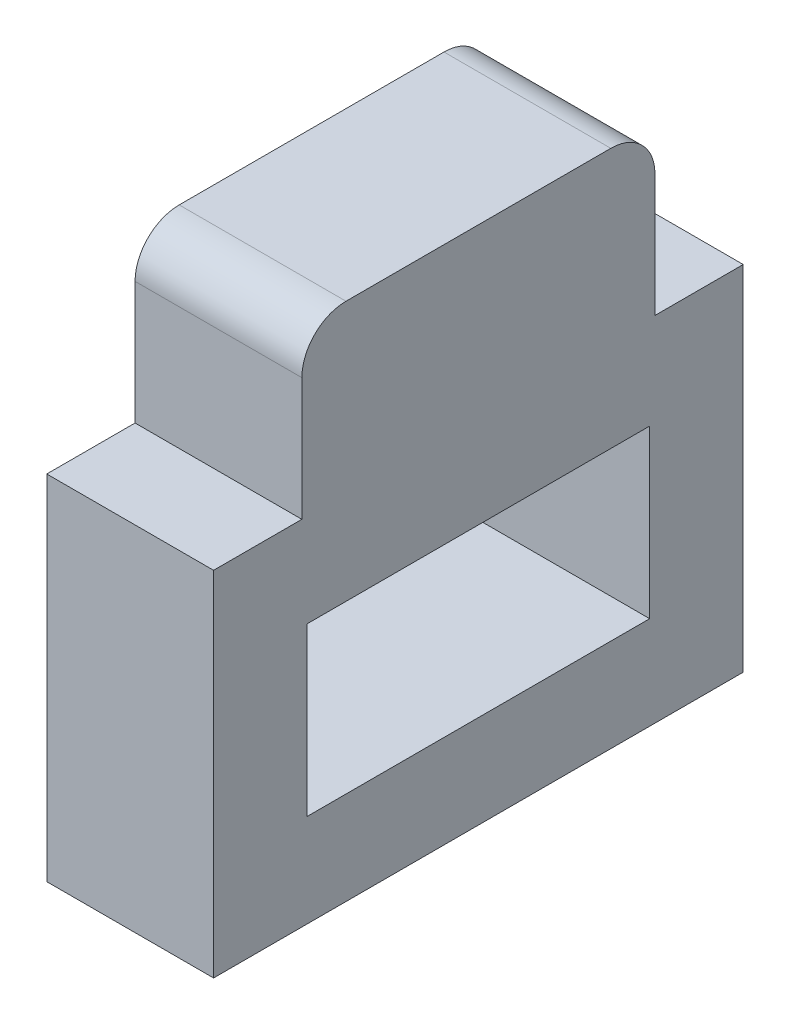
ISO-10303-21;
HEADER;
FILE_DESCRIPTION(('STEP AP214'),'2;1');
FILE_NAME('part.step','',(''),(''),'','','');
FILE_SCHEMA(('AUTOMOTIVE_DESIGN { 1 0 10303 214 1 1 1 1 }'));
ENDSEC;
DATA;
#1=APPLICATION_CONTEXT('core data for automotive mechanical design processes');
#2=APPLICATION_PROTOCOL_DEFINITION('international standard','automotive_design',2000,#1);
#3=PRODUCT_CONTEXT('',#1,'mechanical');
#4=PRODUCT('Part','Part','',(#3));
#5=PRODUCT_RELATED_PRODUCT_CATEGORY('part','',(#4));
#6=PRODUCT_DEFINITION_FORMATION('','',#4);
#7=PRODUCT_DEFINITION_CONTEXT('part definition',#1,'design');
#8=PRODUCT_DEFINITION('design','',#6,#7);
#9=PRODUCT_DEFINITION_SHAPE('','',#8);
#10=(LENGTH_UNIT() NAMED_UNIT(*) SI_UNIT(.MILLI.,.METRE.));
#11=(NAMED_UNIT(*) PLANE_ANGLE_UNIT() SI_UNIT($,.RADIAN.));
#12=(NAMED_UNIT(*) SI_UNIT($,.STERADIAN.) SOLID_ANGLE_UNIT());
#13=UNCERTAINTY_MEASURE_WITH_UNIT(LENGTH_MEASURE(1.E-05),#10,'distance_accuracy_value','');
#14=(GEOMETRIC_REPRESENTATION_CONTEXT(3) GLOBAL_UNCERTAINTY_ASSIGNED_CONTEXT((#13)) GLOBAL_UNIT_ASSIGNED_CONTEXT((#10,
#11,#12)) REPRESENTATION_CONTEXT('',''));
#15=CARTESIAN_POINT('',(0.,0.,0.));
#16=DIRECTION('',(0.,0.,1.));
#17=DIRECTION('',(1.,0.,0.));
#18=AXIS2_PLACEMENT_3D('',#15,#16,#17);
#19=CARTESIAN_POINT('',(3.,6.35,-9.525));
#20=DIRECTION('',(0.,-1.,0.));
#21=DIRECTION('',(0.,0.,-1.));
#22=AXIS2_PLACEMENT_3D('',#19,#20,#21);
#23=PLANE('',#22);
#24=DIRECTION('',(1.,0.,0.));
#25=VECTOR('',#24,1.);
#26=CARTESIAN_POINT('',(-3.,6.35,6.35));
#27=LINE('',#26,#25);
#28=CARTESIAN_POINT('',(-3.,6.35,6.34999999999999));
#29=VERTEX_POINT('',#28);
#30=CARTESIAN_POINT('',(3.,6.35,6.35));
#31=VERTEX_POINT('',#30);
#32=EDGE_CURVE('E216',#29,#31,#27,.T.);
#33=ORIENTED_EDGE('',*,*,#32,.F.);
#34=DIRECTION('',(0.,0.,1.));
#35=VECTOR('',#34,1.);
#36=CARTESIAN_POINT('',(-3.,6.35,-9.525));
#37=LINE('',#36,#35);
#38=CARTESIAN_POINT('',(-3.,6.35,9.52500000000001));
#39=VERTEX_POINT('',#38);
#40=EDGE_CURVE('E291',#29,#39,#37,.T.);
#41=ORIENTED_EDGE('',*,*,#40,.T.);
#42=DIRECTION('',(-1.,0.,0.));
#43=VECTOR('',#42,1.);
#44=CARTESIAN_POINT('',(3.,6.35,9.52500000000001));
#45=LINE('',#44,#43);
#46=CARTESIAN_POINT('',(3.,6.35,9.52500000000001));
#47=VERTEX_POINT('',#46);
#48=EDGE_CURVE('E282',#47,#39,#45,.T.);
#49=ORIENTED_EDGE('',*,*,#48,.F.);
#50=DIRECTION('',(0.,0.,1.));
#51=VECTOR('',#50,1.);
#52=CARTESIAN_POINT('',(3.,6.35,-9.525));
#53=LINE('',#52,#51);
#54=EDGE_CURVE('E305',#31,#47,#53,.T.);
#55=ORIENTED_EDGE('',*,*,#54,.F.);
#56=EDGE_LOOP('',(#33,#41,#49,#55));
#57=FACE_BOUND('',#56,.T.);
#58=ADVANCED_FACE('F48',(#57),#23,.F.);
#59=CARTESIAN_POINT('',(3.,-6.35,9.52500000000001));
#60=DIRECTION('',(0.,0.,-1.));
#61=DIRECTION('',(-1.,0.,0.));
#62=AXIS2_PLACEMENT_3D('',#59,#60,#61);
#63=PLANE('',#62);
#64=DIRECTION('',(0.,-1.,0.));
#65=VECTOR('',#64,1.);
#66=CARTESIAN_POINT('',(-3.,-6.35,9.52500000000001));
#67=LINE('',#66,#65);
#68=CARTESIAN_POINT('',(-3.,-6.35,9.52500000000001));
#69=VERTEX_POINT('',#68);
#70=EDGE_CURVE('E298',#39,#69,#67,.T.);
#71=ORIENTED_EDGE('',*,*,#70,.T.);
#72=DIRECTION('',(-1.,0.,0.));
#73=VECTOR('',#72,1.);
#74=CARTESIAN_POINT('',(3.,-6.35,9.52500000000001));
#75=LINE('',#74,#73);
#76=CARTESIAN_POINT('',(3.,-6.35,9.52500000000001));
#77=VERTEX_POINT('',#76);
#78=EDGE_CURVE('E267',#77,#69,#75,.T.);
#79=ORIENTED_EDGE('',*,*,#78,.F.);
#80=DIRECTION('',(0.,-1.,0.));
#81=VECTOR('',#80,1.);
#82=CARTESIAN_POINT('',(3.,-6.35,9.52500000000001));
#83=LINE('',#82,#81);
#84=EDGE_CURVE('E290',#47,#77,#83,.T.);
#85=ORIENTED_EDGE('',*,*,#84,.F.);
#86=ORIENTED_EDGE('',*,*,#48,.T.);
#87=EDGE_LOOP('',(#71,#79,#85,#86));
#88=FACE_BOUND('',#87,.T.);
#89=ADVANCED_FACE('F338',(#88),#63,.F.);
#90=CARTESIAN_POINT('',(3.,-6.35,-9.525));
#91=DIRECTION('',(0.,1.,0.));
#92=DIRECTION('',(0.,0.,1.));
#93=AXIS2_PLACEMENT_3D('',#90,#91,#92);
#94=PLANE('',#93);
#95=DIRECTION('',(0.,0.,-1.));
#96=VECTOR('',#95,1.);
#97=CARTESIAN_POINT('',(-3.,-6.35,-9.525));
#98=LINE('',#97,#96);
#99=CARTESIAN_POINT('',(-3.,-6.35,-9.525));
#100=VERTEX_POINT('',#99);
#101=EDGE_CURVE('E295',#69,#100,#98,.T.);
#102=ORIENTED_EDGE('',*,*,#101,.T.);
#103=DIRECTION('',(-1.,0.,0.));
#104=VECTOR('',#103,1.);
#105=CARTESIAN_POINT('',(3.,-6.35,-9.525));
#106=LINE('',#105,#104);
#107=CARTESIAN_POINT('',(3.,-6.35,-9.525));
#108=VERTEX_POINT('',#107);
#109=EDGE_CURVE('E270',#108,#100,#106,.T.);
#110=ORIENTED_EDGE('',*,*,#109,.F.);
#111=DIRECTION('',(0.,0.,-1.));
#112=VECTOR('',#111,1.);
#113=CARTESIAN_POINT('',(3.,-6.35,-9.525));
#114=LINE('',#113,#112);
#115=EDGE_CURVE('E316',#77,#108,#114,.T.);
#116=ORIENTED_EDGE('',*,*,#115,.F.);
#117=ORIENTED_EDGE('',*,*,#78,.T.);
#118=EDGE_LOOP('',(#102,#110,#116,#117));
#119=FACE_BOUND('',#118,.T.);
#120=ADVANCED_FACE('F340',(#119),#94,.F.);
#121=CARTESIAN_POINT('',(3.,-6.35,-9.525));
#122=DIRECTION('',(0.,0.,1.));
#123=DIRECTION('',(0.,-1.,0.));
#124=AXIS2_PLACEMENT_3D('',#121,#122,#123);
#125=PLANE('',#124);
#126=DIRECTION('',(0.,1.,0.));
#127=VECTOR('',#126,1.);
#128=CARTESIAN_POINT('',(-3.,-6.35,-9.525));
#129=LINE('',#128,#127);
#130=CARTESIAN_POINT('',(-3.,6.35,-9.525));
#131=VERTEX_POINT('',#130);
#132=EDGE_CURVE('E292',#100,#131,#129,.T.);
#133=ORIENTED_EDGE('',*,*,#132,.T.);
#134=DIRECTION('',(-1.,0.,0.));
#135=VECTOR('',#134,1.);
#136=CARTESIAN_POINT('',(3.,6.35,-9.525));
#137=LINE('',#136,#135);
#138=CARTESIAN_POINT('',(3.,6.35,-9.525));
#139=VERTEX_POINT('',#138);
#140=EDGE_CURVE('E276',#139,#131,#137,.T.);
#141=ORIENTED_EDGE('',*,*,#140,.F.);
#142=DIRECTION('',(0.,1.,0.));
#143=VECTOR('',#142,1.);
#144=CARTESIAN_POINT('',(3.,-6.35,-9.525));
#145=LINE('',#144,#143);
#146=EDGE_CURVE('E306',#108,#139,#145,.T.);
#147=ORIENTED_EDGE('',*,*,#146,.F.);
#148=ORIENTED_EDGE('',*,*,#109,.T.);
#149=EDGE_LOOP('',(#133,#141,#147,#148));
#150=FACE_BOUND('',#149,.T.);
#151=ADVANCED_FACE('F342',(#150),#125,.F.);
#152=CARTESIAN_POINT('',(-3.,6.35,-6.35));
#153=VERTEX_POINT('',#152);
#154=EDGE_CURVE('E287',#131,#153,#37,.T.);
#155=ORIENTED_EDGE('',*,*,#154,.T.);
#156=DIRECTION('',(1.,0.,0.));
#157=VECTOR('',#156,1.);
#158=CARTESIAN_POINT('',(-3.,6.35,-6.35));
#159=LINE('',#158,#157);
#160=CARTESIAN_POINT('',(3.,6.35,-6.35));
#161=VERTEX_POINT('',#160);
#162=EDGE_CURVE('E206',#153,#161,#159,.T.);
#163=ORIENTED_EDGE('',*,*,#162,.T.);
#164=EDGE_CURVE('E286',#139,#161,#53,.T.);
#165=ORIENTED_EDGE('',*,*,#164,.F.);
#166=ORIENTED_EDGE('',*,*,#140,.T.);
#167=EDGE_LOOP('',(#155,#163,#165,#166));
#168=FACE_BOUND('',#167,.T.);
#169=ADVANCED_FACE('F345',(#168),#23,.F.);
#170=CARTESIAN_POINT('',(3.,0.,0.));
#171=DIRECTION('',(1.,0.,0.));
#172=DIRECTION('',(0.,0.,-1.));
#173=AXIS2_PLACEMENT_3D('',#170,#171,#172);
#174=PLANE('',#173);
#175=DIRECTION('',(0.,-1.,0.));
#176=VECTOR('',#175,1.);
#177=CARTESIAN_POINT('',(3.,-2.999999969,6.1595));
#178=LINE('',#177,#176);
#179=CARTESIAN_POINT('',(3.,2.999999969,6.1595));
#180=VERTEX_POINT('',#179);
#181=CARTESIAN_POINT('',(3.,-2.999999969,6.1595));
#182=VERTEX_POINT('',#181);
#183=EDGE_CURVE('E158',#180,#182,#178,.T.);
#184=ORIENTED_EDGE('',*,*,#183,.F.);
#185=DIRECTION('',(0.,0.,1.));
#186=VECTOR('',#185,1.);
#187=CARTESIAN_POINT('',(3.,2.999999969,-6.1595));
#188=LINE('',#187,#186);
#189=CARTESIAN_POINT('',(3.,2.999999969,-6.1595));
#190=VERTEX_POINT('',#189);
#191=EDGE_CURVE('E179',#190,#180,#188,.T.);
#192=ORIENTED_EDGE('',*,*,#191,.F.);
#193=DIRECTION('',(0.,1.,0.));
#194=VECTOR('',#193,1.);
#195=CARTESIAN_POINT('',(3.,-2.999999969,-6.1595));
#196=LINE('',#195,#194);
#197=CARTESIAN_POINT('',(3.,-2.999999969,-6.1595));
#198=VERTEX_POINT('',#197);
#199=EDGE_CURVE('E183',#198,#190,#196,.T.);
#200=ORIENTED_EDGE('',*,*,#199,.F.);
#201=DIRECTION('',(0.,0.,-1.));
#202=VECTOR('',#201,1.);
#203=CARTESIAN_POINT('',(3.,-2.999999969,-6.1595));
#204=LINE('',#203,#202);
#205=EDGE_CURVE('E193',#182,#198,#204,.T.);
#206=ORIENTED_EDGE('',*,*,#205,.F.);
#207=EDGE_LOOP('',(#184,#192,#200,#206));
#208=FACE_BOUND('',#207,.T.);
#209=DIRECTION('',(0.,-1.,0.));
#210=VECTOR('',#209,1.);
#211=CARTESIAN_POINT('',(3.,12.35,-6.35));
#212=LINE('',#211,#210);
#213=CARTESIAN_POINT('',(3.,10.7625,-6.35));
#214=VERTEX_POINT('',#213);
#215=EDGE_CURVE('E263',#214,#161,#212,.T.);
#216=ORIENTED_EDGE('',*,*,#215,.F.);
#217=CARTESIAN_POINT('',(3.,10.7625,-4.7625));
#218=DIRECTION('',(1.,0.,0.));
#219=DIRECTION('',(0.,0.,-1.));
#220=AXIS2_PLACEMENT_3D('',#217,#218,#219);
#221=CIRCLE('',#220,1.5875);
#222=CARTESIAN_POINT('',(3.,12.35,-4.7625));
#223=VERTEX_POINT('',#222);
#224=EDGE_CURVE('E235',#214,#223,#221,.T.);
#225=ORIENTED_EDGE('',*,*,#224,.T.);
#226=DIRECTION('',(0.,0.,-1.));
#227=VECTOR('',#226,1.);
#228=CARTESIAN_POINT('',(3.,12.35,6.35));
#229=LINE('',#228,#227);
#230=CARTESIAN_POINT('',(3.,12.35,4.7625));
#231=VERTEX_POINT('',#230);
#232=EDGE_CURVE('E215',#231,#223,#229,.T.);
#233=ORIENTED_EDGE('',*,*,#232,.F.);
#234=CARTESIAN_POINT('',(3.,10.7625,4.7625));
#235=DIRECTION('',(1.,0.,0.));
#236=DIRECTION('',(0.,0.,-1.));
#237=AXIS2_PLACEMENT_3D('',#234,#235,#236);
#238=CIRCLE('',#237,1.5875);
#239=CARTESIAN_POINT('',(3.,10.7625,6.35));
#240=VERTEX_POINT('',#239);
#241=EDGE_CURVE('E231',#231,#240,#238,.T.);
#242=ORIENTED_EDGE('',*,*,#241,.T.);
#243=DIRECTION('',(0.,-1.,0.));
#244=VECTOR('',#243,1.);
#245=CARTESIAN_POINT('',(3.,12.35,6.35));
#246=LINE('',#245,#244);
#247=EDGE_CURVE('E331',#240,#31,#246,.T.);
#248=ORIENTED_EDGE('',*,*,#247,.T.);
#249=ORIENTED_EDGE('',*,*,#54,.T.);
#250=ORIENTED_EDGE('',*,*,#84,.T.);
#251=ORIENTED_EDGE('',*,*,#115,.T.);
#252=ORIENTED_EDGE('',*,*,#146,.T.);
#253=ORIENTED_EDGE('',*,*,#164,.T.);
#254=EDGE_LOOP('',(#216,#225,#233,#242,#248,#249,#250,#251,#252,#253));
#255=FACE_BOUND('',#254,.T.);
#256=ADVANCED_FACE('F329',(#208,#255),#174,.T.);
#257=CARTESIAN_POINT('',(-3.,0.,0.));
#258=DIRECTION('',(1.,0.,0.));
#259=DIRECTION('',(0.,0.,-1.));
#260=AXIS2_PLACEMENT_3D('',#257,#258,#259);
#261=PLANE('',#260);
#262=DIRECTION('',(0.,0.,1.));
#263=VECTOR('',#262,1.);
#264=CARTESIAN_POINT('',(-3.,2.999999969,-6.1595));
#265=LINE('',#264,#263);
#266=CARTESIAN_POINT('',(-3.,2.999999969,-6.1595));
#267=VERTEX_POINT('',#266);
#268=CARTESIAN_POINT('',(-3.,2.999999969,6.1595));
#269=VERTEX_POINT('',#268);
#270=EDGE_CURVE('E164',#267,#269,#265,.T.);
#271=ORIENTED_EDGE('',*,*,#270,.T.);
#272=DIRECTION('',(0.,-1.,0.));
#273=VECTOR('',#272,1.);
#274=CARTESIAN_POINT('',(-3.,-2.999999969,6.1595));
#275=LINE('',#274,#273);
#276=CARTESIAN_POINT('',(-3.,-2.999999969,6.1595));
#277=VERTEX_POINT('',#276);
#278=EDGE_CURVE('E155',#269,#277,#275,.T.);
#279=ORIENTED_EDGE('',*,*,#278,.T.);
#280=DIRECTION('',(0.,0.,-1.));
#281=VECTOR('',#280,1.);
#282=CARTESIAN_POINT('',(-3.,-2.999999969,-6.1595));
#283=LINE('',#282,#281);
#284=CARTESIAN_POINT('',(-3.,-2.999999969,-6.1595));
#285=VERTEX_POINT('',#284);
#286=EDGE_CURVE('E168',#277,#285,#283,.T.);
#287=ORIENTED_EDGE('',*,*,#286,.T.);
#288=DIRECTION('',(0.,1.,0.));
#289=VECTOR('',#288,1.);
#290=CARTESIAN_POINT('',(-3.,-2.999999969,-6.1595));
#291=LINE('',#290,#289);
#292=EDGE_CURVE('E173',#285,#267,#291,.T.);
#293=ORIENTED_EDGE('',*,*,#292,.T.);
#294=EDGE_LOOP('',(#271,#279,#287,#293));
#295=FACE_BOUND('',#294,.T.);
#296=DIRECTION('',(0.,0.,-1.));
#297=VECTOR('',#296,1.);
#298=CARTESIAN_POINT('',(-3.,12.35,6.35));
#299=LINE('',#298,#297);
#300=CARTESIAN_POINT('',(-3.,12.35,4.7625));
#301=VERTEX_POINT('',#300);
#302=CARTESIAN_POINT('',(-3.,12.35,-4.7625));
#303=VERTEX_POINT('',#302);
#304=EDGE_CURVE('E212',#301,#303,#299,.T.);
#305=ORIENTED_EDGE('',*,*,#304,.T.);
#306=CARTESIAN_POINT('',(-3.,10.7625,-4.7625));
#307=DIRECTION('',(1.,0.,0.));
#308=DIRECTION('',(0.,0.,-1.));
#309=AXIS2_PLACEMENT_3D('',#306,#307,#308);
#310=CIRCLE('',#309,1.5875);
#311=CARTESIAN_POINT('',(-3.,10.7625,-6.35));
#312=VERTEX_POINT('',#311);
#313=EDGE_CURVE('E57',#303,#312,#310,.F.);
#314=ORIENTED_EDGE('',*,*,#313,.T.);
#315=DIRECTION('',(0.,-1.,0.));
#316=VECTOR('',#315,1.);
#317=CARTESIAN_POINT('',(-3.,12.35,-6.35));
#318=LINE('',#317,#316);
#319=EDGE_CURVE('E220',#312,#153,#318,.T.);
#320=ORIENTED_EDGE('',*,*,#319,.T.);
#321=ORIENTED_EDGE('',*,*,#154,.F.);
#322=ORIENTED_EDGE('',*,*,#132,.F.);
#323=ORIENTED_EDGE('',*,*,#101,.F.);
#324=ORIENTED_EDGE('',*,*,#70,.F.);
#325=ORIENTED_EDGE('',*,*,#40,.F.);
#326=DIRECTION('',(0.,-1.,0.));
#327=VECTOR('',#326,1.);
#328=CARTESIAN_POINT('',(-3.,12.35,6.35));
#329=LINE('',#328,#327);
#330=CARTESIAN_POINT('',(-3.,10.7625,6.35));
#331=VERTEX_POINT('',#330);
#332=EDGE_CURVE('E300',#331,#29,#329,.T.);
#333=ORIENTED_EDGE('',*,*,#332,.F.);
#334=CARTESIAN_POINT('',(-3.,10.7625,4.7625));
#335=DIRECTION('',(1.,0.,0.));
#336=DIRECTION('',(0.,0.,-1.));
#337=AXIS2_PLACEMENT_3D('',#334,#335,#336);
#338=CIRCLE('',#337,1.5875);
#339=EDGE_CURVE('E247',#331,#301,#338,.F.);
#340=ORIENTED_EDGE('',*,*,#339,.T.);
#341=EDGE_LOOP('',(#305,#314,#320,#321,#322,#323,#324,#325,#333,#340));
#342=FACE_BOUND('',#341,.T.);
#343=ADVANCED_FACE('F175',(#295,#342),#261,.F.);
#344=CARTESIAN_POINT('',(-3.,12.35,6.35));
#345=DIRECTION('',(0.,0.,-1.));
#346=DIRECTION('',(0.,1.,0.));
#347=AXIS2_PLACEMENT_3D('',#344,#345,#346);
#348=PLANE('',#347);
#349=ORIENTED_EDGE('',*,*,#247,.F.);
#350=DIRECTION('',(1.,0.,0.));
#351=VECTOR('',#350,1.);
#352=CARTESIAN_POINT('',(-3.,10.7625,6.35));
#353=LINE('',#352,#351);
#354=EDGE_CURVE('E12',#240,#331,#353,.F.);
#355=ORIENTED_EDGE('',*,*,#354,.T.);
#356=ORIENTED_EDGE('',*,*,#332,.T.);
#357=ORIENTED_EDGE('',*,*,#32,.T.);
#358=EDGE_LOOP('',(#349,#355,#356,#357));
#359=FACE_BOUND('',#358,.T.);
#360=ADVANCED_FACE('F355',(#359),#348,.F.);
#361=CARTESIAN_POINT('',(-3.,12.35,-6.35));
#362=DIRECTION('',(0.,0.,-1.));
#363=DIRECTION('',(0.,1.,0.));
#364=AXIS2_PLACEMENT_3D('',#361,#362,#363);
#365=PLANE('',#364);
#366=ORIENTED_EDGE('',*,*,#319,.F.);
#367=DIRECTION('',(1.,0.,0.));
#368=VECTOR('',#367,1.);
#369=CARTESIAN_POINT('',(3.,10.7625,-6.35));
#370=LINE('',#369,#368);
#371=EDGE_CURVE('E236',#312,#214,#370,.T.);
#372=ORIENTED_EDGE('',*,*,#371,.T.);
#373=ORIENTED_EDGE('',*,*,#215,.T.);
#374=ORIENTED_EDGE('',*,*,#162,.F.);
#375=EDGE_LOOP('',(#366,#372,#373,#374));
#376=FACE_BOUND('',#375,.T.);
#377=ADVANCED_FACE('F259',(#376),#365,.T.);
#378=CARTESIAN_POINT('',(0.,12.35,0.));
#379=DIRECTION('',(0.,-1.,0.));
#380=DIRECTION('',(0.,0.,-1.));
#381=AXIS2_PLACEMENT_3D('',#378,#379,#380);
#382=PLANE('',#381);
#383=ORIENTED_EDGE('',*,*,#232,.T.);
#384=DIRECTION('',(1.,0.,0.));
#385=VECTOR('',#384,1.);
#386=CARTESIAN_POINT('',(-3.,12.35,-4.7625));
#387=LINE('',#386,#385);
#388=EDGE_CURVE('E70',#223,#303,#387,.F.);
#389=ORIENTED_EDGE('',*,*,#388,.T.);
#390=ORIENTED_EDGE('',*,*,#304,.F.);
#391=DIRECTION('',(1.,0.,0.));
#392=VECTOR('',#391,1.);
#393=CARTESIAN_POINT('',(0.,12.35,4.7625));
#394=LINE('',#393,#392);
#395=EDGE_CURVE('E241',#301,#231,#394,.T.);
#396=ORIENTED_EDGE('',*,*,#395,.T.);
#397=EDGE_LOOP('',(#383,#389,#390,#396));
#398=FACE_BOUND('',#397,.T.);
#399=ADVANCED_FACE('F359',(#398),#382,.F.);
#400=CARTESIAN_POINT('',(-3.,-2.999999969,6.1595));
#401=DIRECTION('',(0.,0.,1.));
#402=DIRECTION('',(1.,0.,0.));
#403=AXIS2_PLACEMENT_3D('',#400,#401,#402);
#404=PLANE('',#403);
#405=ORIENTED_EDGE('',*,*,#183,.T.);
#406=DIRECTION('',(1.,0.,0.));
#407=VECTOR('',#406,1.);
#408=CARTESIAN_POINT('',(-3.,-2.999999969,6.1595));
#409=LINE('',#408,#407);
#410=EDGE_CURVE('E151',#277,#182,#409,.T.);
#411=ORIENTED_EDGE('',*,*,#410,.F.);
#412=ORIENTED_EDGE('',*,*,#278,.F.);
#413=DIRECTION('',(1.,0.,0.));
#414=VECTOR('',#413,1.);
#415=CARTESIAN_POINT('',(-3.,2.999999969,6.1595));
#416=LINE('',#415,#414);
#417=EDGE_CURVE('E203',#269,#180,#416,.T.);
#418=ORIENTED_EDGE('',*,*,#417,.T.);
#419=EDGE_LOOP('',(#405,#411,#412,#418));
#420=FACE_BOUND('',#419,.T.);
#421=ADVANCED_FACE('F153',(#420),#404,.F.);
#422=CARTESIAN_POINT('',(-3.,2.999999969,-6.1595));
#423=DIRECTION('',(0.,1.,0.));
#424=DIRECTION('',(0.,0.,1.));
#425=AXIS2_PLACEMENT_3D('',#422,#423,#424);
#426=PLANE('',#425);
#427=ORIENTED_EDGE('',*,*,#191,.T.);
#428=ORIENTED_EDGE('',*,*,#417,.F.);
#429=ORIENTED_EDGE('',*,*,#270,.F.);
#430=DIRECTION('',(1.,0.,0.));
#431=VECTOR('',#430,1.);
#432=CARTESIAN_POINT('',(-3.,2.999999969,-6.1595));
#433=LINE('',#432,#431);
#434=EDGE_CURVE('E207',#267,#190,#433,.T.);
#435=ORIENTED_EDGE('',*,*,#434,.T.);
#436=EDGE_LOOP('',(#427,#428,#429,#435));
#437=FACE_BOUND('',#436,.T.);
#438=ADVANCED_FACE('F367',(#437),#426,.F.);
#439=CARTESIAN_POINT('',(-3.,-2.999999969,-6.1595));
#440=DIRECTION('',(0.,0.,-1.));
#441=DIRECTION('',(-1.,0.,0.));
#442=AXIS2_PLACEMENT_3D('',#439,#440,#441);
#443=PLANE('',#442);
#444=ORIENTED_EDGE('',*,*,#199,.T.);
#445=ORIENTED_EDGE('',*,*,#434,.F.);
#446=ORIENTED_EDGE('',*,*,#292,.F.);
#447=DIRECTION('',(1.,0.,0.));
#448=VECTOR('',#447,1.);
#449=CARTESIAN_POINT('',(-3.,-2.999999969,-6.1595));
#450=LINE('',#449,#448);
#451=EDGE_CURVE('E163',#285,#198,#450,.T.);
#452=ORIENTED_EDGE('',*,*,#451,.T.);
#453=EDGE_LOOP('',(#444,#445,#446,#452));
#454=FACE_BOUND('',#453,.T.);
#455=ADVANCED_FACE('F394',(#454),#443,.F.);
#456=CARTESIAN_POINT('',(-3.,-2.999999969,-6.1595));
#457=DIRECTION('',(0.,-1.,0.));
#458=DIRECTION('',(0.,0.,-1.));
#459=AXIS2_PLACEMENT_3D('',#456,#457,#458);
#460=PLANE('',#459);
#461=ORIENTED_EDGE('',*,*,#205,.T.);
#462=ORIENTED_EDGE('',*,*,#451,.F.);
#463=ORIENTED_EDGE('',*,*,#286,.F.);
#464=ORIENTED_EDGE('',*,*,#410,.T.);
#465=EDGE_LOOP('',(#461,#462,#463,#464));
#466=FACE_BOUND('',#465,.T.);
#467=ADVANCED_FACE('F169',(#466),#460,.F.);
#468=CARTESIAN_POINT('',(-3.,10.7625,-4.7625));
#469=DIRECTION('',(-1.,0.,0.));
#470=DIRECTION('',(0.,0.,1.));
#471=AXIS2_PLACEMENT_3D('',#468,#469,#470);
#472=CYLINDRICAL_SURFACE('',#471,1.5875);
#473=ORIENTED_EDGE('',*,*,#313,.F.);
#474=ORIENTED_EDGE('',*,*,#388,.F.);
#475=ORIENTED_EDGE('',*,*,#224,.F.);
#476=ORIENTED_EDGE('',*,*,#371,.F.);
#477=EDGE_LOOP('',(#473,#474,#475,#476));
#478=FACE_BOUND('',#477,.T.);
#479=ADVANCED_FACE('F265',(#478),#472,.T.);
#480=CARTESIAN_POINT('',(0.,10.7625,4.7625));
#481=DIRECTION('',(1.,0.,0.));
#482=DIRECTION('',(0.,0.,-1.));
#483=AXIS2_PLACEMENT_3D('',#480,#481,#482);
#484=CYLINDRICAL_SURFACE('',#483,1.5875);
#485=ORIENTED_EDGE('',*,*,#339,.F.);
#486=ORIENTED_EDGE('',*,*,#354,.F.);
#487=ORIENTED_EDGE('',*,*,#241,.F.);
#488=ORIENTED_EDGE('',*,*,#395,.F.);
#489=EDGE_LOOP('',(#485,#486,#487,#488));
#490=FACE_BOUND('',#489,.T.);
#491=ADVANCED_FACE('F50',(#490),#484,.T.);
#492=CLOSED_SHELL('',(#58,#89,#120,#151,#169,#256,#343,#360,#377,#399,#421,#438,#455,#467,#479,#491));
#493=MANIFOLD_SOLID_BREP('B2',#492);
#494=ADVANCED_BREP_SHAPE_REPRESENTATION('',(#18,#493),#14);
#495=SHAPE_DEFINITION_REPRESENTATION(#9,#494);
ENDSEC;
END-ISO-10303-21;
